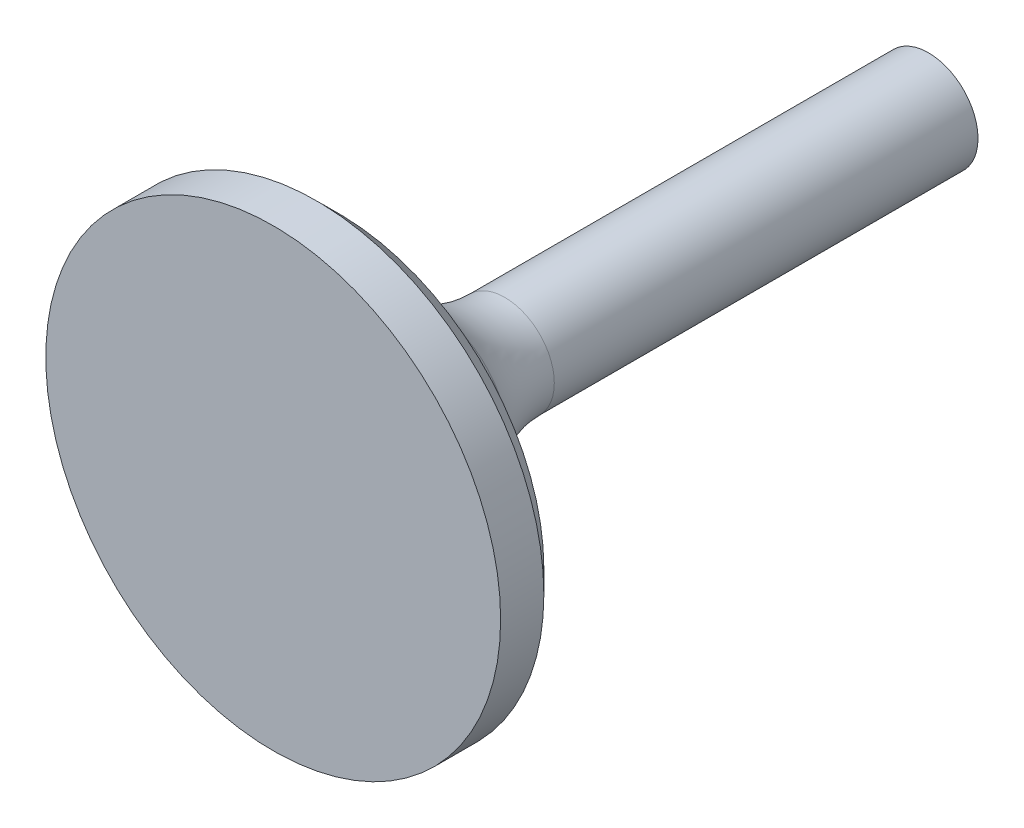
ISO-10303-21;
HEADER;
FILE_DESCRIPTION(('STEP AP214'),'2;1');
FILE_NAME('part.step','',(''),(''),'','','');
FILE_SCHEMA(('AUTOMOTIVE_DESIGN { 1 0 10303 214 1 1 1 1 }'));
ENDSEC;
DATA;
#1=APPLICATION_CONTEXT('core data for automotive mechanical design processes');
#2=APPLICATION_PROTOCOL_DEFINITION('international standard','automotive_design',2000,#1);
#3=PRODUCT_CONTEXT('',#1,'mechanical');
#4=PRODUCT('Part','Part','',(#3));
#5=PRODUCT_RELATED_PRODUCT_CATEGORY('part','',(#4));
#6=PRODUCT_DEFINITION_FORMATION('','',#4);
#7=PRODUCT_DEFINITION_CONTEXT('part definition',#1,'design');
#8=PRODUCT_DEFINITION('design','',#6,#7);
#9=PRODUCT_DEFINITION_SHAPE('','',#8);
#10=(LENGTH_UNIT() NAMED_UNIT(*) SI_UNIT(.MILLI.,.METRE.));
#11=(NAMED_UNIT(*) PLANE_ANGLE_UNIT() SI_UNIT($,.RADIAN.));
#12=(NAMED_UNIT(*) SI_UNIT($,.STERADIAN.) SOLID_ANGLE_UNIT());
#13=UNCERTAINTY_MEASURE_WITH_UNIT(LENGTH_MEASURE(1.E-05),#10,'distance_accuracy_value','');
#14=(GEOMETRIC_REPRESENTATION_CONTEXT(3) GLOBAL_UNCERTAINTY_ASSIGNED_CONTEXT((#13)) GLOBAL_UNIT_ASSIGNED_CONTEXT((#10,
#11,#12)) REPRESENTATION_CONTEXT('',''));
#15=CARTESIAN_POINT('',(0.,0.,0.));
#16=DIRECTION('',(0.,0.,1.));
#17=DIRECTION('',(1.,0.,0.));
#18=AXIS2_PLACEMENT_3D('',#15,#16,#17);
#19=CARTESIAN_POINT('',(0.,0.,23.776136543563));
#20=DIRECTION('',(0.,0.,1.));
#21=DIRECTION('',(1.,0.,0.));
#22=AXIS2_PLACEMENT_3D('',#19,#20,#21);
#23=PLANE('',#22);
#24=CARTESIAN_POINT('',(0.,0.,23.776136543563));
#25=DIRECTION('',(0.,0.,1.));
#26=DIRECTION('',(1.,0.,0.));
#27=AXIS2_PLACEMENT_3D('',#24,#25,#26);
#28=CIRCLE('',#27,15.478125);
#29=CARTESIAN_POINT('',(15.478125,0.,23.776136543563));
#30=VERTEX_POINT('',#29);
#31=EDGE_CURVE('E10',#30,#30,#28,.T.);
#32=ORIENTED_EDGE('',*,*,#31,.T.);
#33=EDGE_LOOP('',(#32));
#34=FACE_BOUND('',#33,.T.);
#35=ADVANCED_FACE('F30',(#34),#23,.T.);
#36=CARTESIAN_POINT('',(0.,0.,23.776136543563));
#37=DIRECTION('',(0.,0.,1.));
#38=DIRECTION('',(1.,0.,0.));
#39=AXIS2_PLACEMENT_3D('',#36,#37,#38);
#40=CYLINDRICAL_SURFACE('',#39,15.478125);
#41=CARTESIAN_POINT('',(0.,0.,20.835299143563));
#42=DIRECTION('',(0.,0.,1.));
#43=DIRECTION('',(1.,0.,0.));
#44=AXIS2_PLACEMENT_3D('',#41,#42,#43);
#45=CIRCLE('',#44,15.478125);
#46=CARTESIAN_POINT('',(15.478125,0.,20.835299143563));
#47=VERTEX_POINT('',#46);
#48=EDGE_CURVE('E36',#47,#47,#45,.T.);
#49=ORIENTED_EDGE('',*,*,#48,.T.);
#50=EDGE_LOOP('',(#49));
#51=FACE_BOUND('',#50,.T.);
#52=ORIENTED_EDGE('',*,*,#31,.F.);
#53=EDGE_LOOP('',(#52));
#54=FACE_BOUND('',#53,.T.);
#55=ADVANCED_FACE('F71',(#51,#54),#40,.T.);
#56=CARTESIAN_POINT('',(0.,0.,20.835299143563));
#57=DIRECTION('',(0.,0.,1.));
#58=DIRECTION('',(1.,0.,0.));
#59=AXIS2_PLACEMENT_3D('',#56,#57,#58);
#60=CONICAL_SURFACE('',#59,15.478125,0.785398163397454);
#61=CARTESIAN_POINT('',(0.,0.,19.2874866435631));
#62=DIRECTION('',(0.,0.,1.));
#63=DIRECTION('',(1.,0.,0.));
#64=AXIS2_PLACEMENT_3D('',#61,#62,#63);
#65=CIRCLE('',#64,13.9303125);
#66=CARTESIAN_POINT('',(13.9303125,0.,19.2874866435631));
#67=VERTEX_POINT('',#66);
#68=EDGE_CURVE('E40',#67,#67,#65,.T.);
#69=ORIENTED_EDGE('',*,*,#68,.T.);
#70=EDGE_LOOP('',(#69));
#71=FACE_BOUND('',#70,.T.);
#72=ORIENTED_EDGE('',*,*,#48,.F.);
#73=EDGE_LOOP('',(#72));
#74=FACE_BOUND('',#73,.T.);
#75=ADVANCED_FACE('F67',(#71,#74),#60,.T.);
#76=CARTESIAN_POINT('',(13.9303125,0.,19.2874866435631));
#77=CARTESIAN_POINT('',(10.3196372558728,0.,18.1513452256723));
#78=CARTESIAN_POINT('',(7.55466231083145,0.,15.8284113626488));
#79=CARTESIAN_POINT('',(5.16538432985664,0.,12.9706433096197));
#80=B_SPLINE_CURVE_WITH_KNOTS('',3,(#76,#77,#78,#79),.UNSPECIFIED.,.F.,.F.,(4,4),(0.,
0.797340133226871),.UNSPECIFIED.);
#81=CARTESIAN_POINT('',(0.,0.,23.776136543563));
#82=DIRECTION('',(0.,0.,1.));
#83=AXIS1_PLACEMENT('',#81,#82);
#84=SURFACE_OF_REVOLUTION('',#80,#83);
#85=CARTESIAN_POINT('',(0.,0.,12.9706433096197));
#86=DIRECTION('',(0.,0.,1.));
#87=DIRECTION('',(1.,0.,0.));
#88=AXIS2_PLACEMENT_3D('',#85,#86,#87);
#89=CIRCLE('',#88,5.16538432985664);
#90=CARTESIAN_POINT('',(5.16538432985664,0.,12.9706433096197));
#91=VERTEX_POINT('',#90);
#92=EDGE_CURVE('E44',#91,#91,#89,.T.);
#93=ORIENTED_EDGE('',*,*,#92,.T.);
#94=EDGE_LOOP('',(#93));
#95=FACE_BOUND('',#94,.T.);
#96=ORIENTED_EDGE('',*,*,#68,.F.);
#97=EDGE_LOOP('',(#96));
#98=FACE_BOUND('',#97,.T.);
#99=ADVANCED_FACE('F62',(#95,#98),#84,.F.);
#100=CARTESIAN_POINT('',(0.,0.,8.01174445216527));
#101=DIRECTION('',(0.,0.,1.));
#102=DIRECTION('',(1.,0.,0.));
#103=AXIS2_PLACEMENT_3D('',#100,#101,#102);
#104=TOROIDAL_SURFACE('',#103,11.096625,7.731125);
#105=CARTESIAN_POINT('',(0.,0.,8.01174445216527));
#106=DIRECTION('',(0.,0.,1.));
#107=DIRECTION('',(1.,0.,0.));
#108=AXIS2_PLACEMENT_3D('',#105,#106,#107);
#109=CIRCLE('',#108,3.3655);
#110=CARTESIAN_POINT('',(3.3655,0.,8.01174445216527));
#111=VERTEX_POINT('',#110);
#112=EDGE_CURVE('E49',#111,#111,#109,.T.);
#113=ORIENTED_EDGE('',*,*,#112,.T.);
#114=EDGE_LOOP('',(#113));
#115=FACE_BOUND('',#114,.T.);
#116=ORIENTED_EDGE('',*,*,#92,.F.);
#117=EDGE_LOOP('',(#116));
#118=FACE_BOUND('',#117,.T.);
#119=ADVANCED_FACE('F66',(#115,#118),#104,.F.);
#120=CARTESIAN_POINT('',(0.,0.,23.776136543563));
#121=DIRECTION('',(0.,0.,1.));
#122=DIRECTION('',(1.,0.,0.));
#123=AXIS2_PLACEMENT_3D('',#120,#121,#122);
#124=CYLINDRICAL_SURFACE('',#123,3.3655);
#125=CARTESIAN_POINT('',(0.,0.,-20.8231718258906));
#126=DIRECTION('',(0.,0.,1.));
#127=DIRECTION('',(1.,0.,0.));
#128=AXIS2_PLACEMENT_3D('',#125,#126,#127);
#129=CIRCLE('',#128,3.3655);
#130=CARTESIAN_POINT('',(3.3655,0.,-20.8231718258906));
#131=VERTEX_POINT('',#130);
#132=EDGE_CURVE('E52',#131,#131,#129,.T.);
#133=ORIENTED_EDGE('',*,*,#132,.T.);
#134=EDGE_LOOP('',(#133));
#135=FACE_BOUND('',#134,.T.);
#136=ORIENTED_EDGE('',*,*,#112,.F.);
#137=EDGE_LOOP('',(#136));
#138=FACE_BOUND('',#137,.T.);
#139=ADVANCED_FACE('F105',(#135,#138),#124,.T.);
#140=CARTESIAN_POINT('',(0.,0.,-20.8231718258906));
#141=DIRECTION('',(0.,0.,-1.));
#142=DIRECTION('',(-1.,0.,0.));
#143=AXIS2_PLACEMENT_3D('',#140,#141,#142);
#144=PLANE('',#143);
#145=ORIENTED_EDGE('',*,*,#132,.F.);
#146=EDGE_LOOP('',(#145));
#147=FACE_BOUND('',#146,.T.);
#148=ADVANCED_FACE('F114',(#147),#144,.T.);
#149=CLOSED_SHELL('',(#35,#55,#75,#99,#119,#139,#148));
#150=MANIFOLD_SOLID_BREP('B2',#149);
#151=ADVANCED_BREP_SHAPE_REPRESENTATION('',(#18,#150),#14);
#152=SHAPE_DEFINITION_REPRESENTATION(#9,#151);
ENDSEC;
END-ISO-10303-21;
